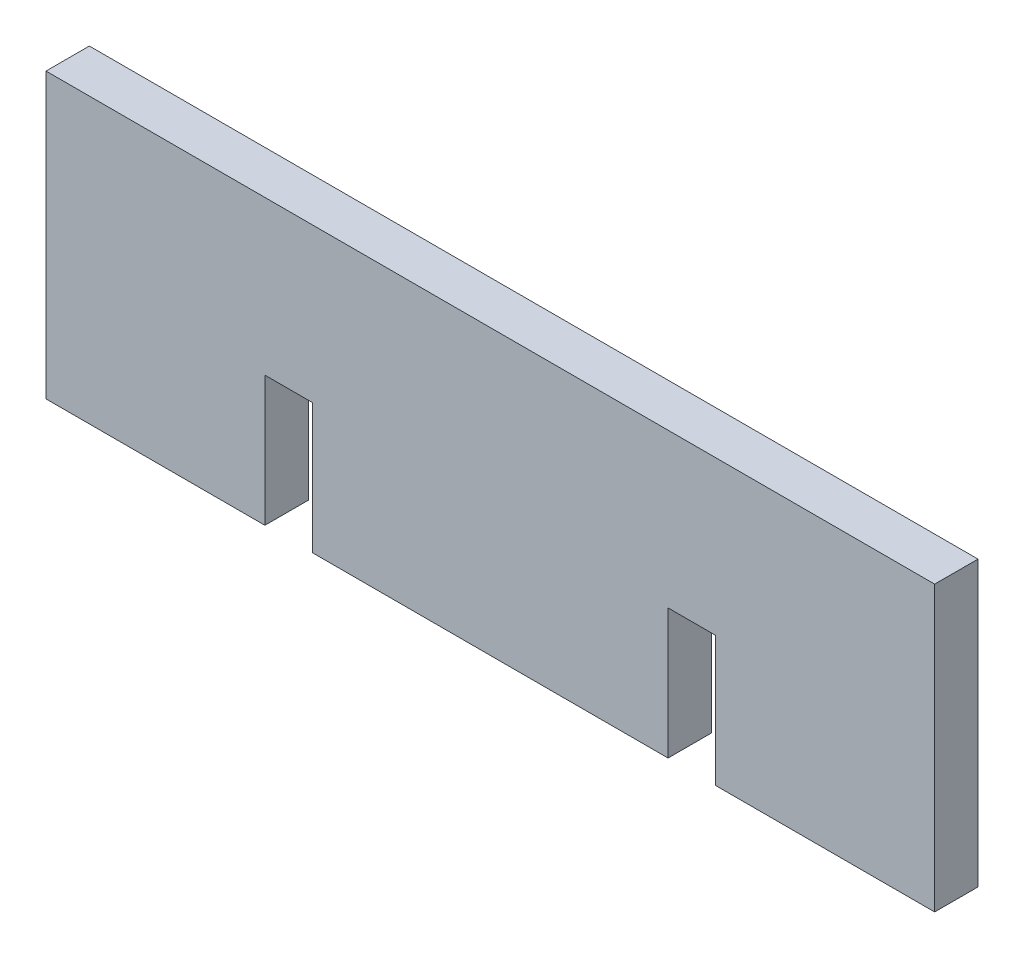
ISO-10303-21;
HEADER;
FILE_DESCRIPTION(('STEP AP214'),'2;1');
FILE_NAME('part.step','',(''),(''),'','','');
FILE_SCHEMA(('AUTOMOTIVE_DESIGN { 1 0 10303 214 1 1 1 1 }'));
ENDSEC;
DATA;
#1=APPLICATION_CONTEXT('core data for automotive mechanical design processes');
#2=APPLICATION_PROTOCOL_DEFINITION('international standard','automotive_design',2000,#1);
#3=PRODUCT_CONTEXT('',#1,'mechanical');
#4=PRODUCT('Part','Part','',(#3));
#5=PRODUCT_RELATED_PRODUCT_CATEGORY('part','',(#4));
#6=PRODUCT_DEFINITION_FORMATION('','',#4);
#7=PRODUCT_DEFINITION_CONTEXT('part definition',#1,'design');
#8=PRODUCT_DEFINITION('design','',#6,#7);
#9=PRODUCT_DEFINITION_SHAPE('','',#8);
#10=(LENGTH_UNIT() NAMED_UNIT(*) SI_UNIT(.MILLI.,.METRE.));
#11=(NAMED_UNIT(*) PLANE_ANGLE_UNIT() SI_UNIT($,.RADIAN.));
#12=(NAMED_UNIT(*) SI_UNIT($,.STERADIAN.) SOLID_ANGLE_UNIT());
#13=UNCERTAINTY_MEASURE_WITH_UNIT(LENGTH_MEASURE(1.E-05),#10,'distance_accuracy_value','');
#14=(GEOMETRIC_REPRESENTATION_CONTEXT(3) GLOBAL_UNCERTAINTY_ASSIGNED_CONTEXT((#13)) GLOBAL_UNIT_ASSIGNED_CONTEXT((#10,
#11,#12)) REPRESENTATION_CONTEXT('',''));
#15=CARTESIAN_POINT('',(0.,0.,0.));
#16=DIRECTION('',(0.,0.,1.));
#17=DIRECTION('',(1.,0.,0.));
#18=AXIS2_PLACEMENT_3D('',#15,#16,#17);
#19=CARTESIAN_POINT('',(52.,0.,10.));
#20=DIRECTION('',(1.,0.,0.));
#21=DIRECTION('',(0.,1.,0.));
#22=AXIS2_PLACEMENT_3D('',#19,#20,#21);
#23=PLANE('',#22);
#24=DIRECTION('',(0.,-1.,0.));
#25=VECTOR('',#24,1.);
#26=CARTESIAN_POINT('',(52.,0.,0.));
#27=LINE('',#26,#25);
#28=CARTESIAN_POINT('',(52.,-2.75000000000001,0.));
#29=VERTEX_POINT('',#28);
#30=CARTESIAN_POINT('',(52.,-32.75,0.));
#31=VERTEX_POINT('',#30);
#32=EDGE_CURVE('E166',#29,#31,#27,.T.);
#33=ORIENTED_EDGE('',*,*,#32,.T.);
#34=DIRECTION('',(0.,0.,-1.));
#35=VECTOR('',#34,1.);
#36=CARTESIAN_POINT('',(52.,-32.75,10.));
#37=LINE('',#36,#35);
#38=CARTESIAN_POINT('',(52.,-32.75,10.));
#39=VERTEX_POINT('',#38);
#40=EDGE_CURVE('E11',#39,#31,#37,.T.);
#41=ORIENTED_EDGE('',*,*,#40,.F.);
#42=DIRECTION('',(0.,-1.,0.));
#43=VECTOR('',#42,1.);
#44=CARTESIAN_POINT('',(52.,0.,10.));
#45=LINE('',#44,#43);
#46=CARTESIAN_POINT('',(52.,-2.75000000000001,10.));
#47=VERTEX_POINT('',#46);
#48=EDGE_CURVE('E207',#47,#39,#45,.T.);
#49=ORIENTED_EDGE('',*,*,#48,.F.);
#50=DIRECTION('',(0.,0.,-1.));
#51=VECTOR('',#50,1.);
#52=CARTESIAN_POINT('',(52.,-2.75000000000001,10.));
#53=LINE('',#52,#51);
#54=EDGE_CURVE('E162',#47,#29,#53,.T.);
#55=ORIENTED_EDGE('',*,*,#54,.T.);
#56=EDGE_LOOP('',(#33,#41,#49,#55));
#57=FACE_BOUND('',#56,.T.);
#58=ADVANCED_FACE('F41',(#57),#23,.F.);
#59=CARTESIAN_POINT('',(0.,-32.75,10.));
#60=DIRECTION('',(0.,1.,0.));
#61=DIRECTION('',(0.,0.,1.));
#62=AXIS2_PLACEMENT_3D('',#59,#60,#61);
#63=PLANE('',#62);
#64=DIRECTION('',(1.,0.,0.));
#65=VECTOR('',#64,1.);
#66=CARTESIAN_POINT('',(0.,-32.75,0.));
#67=LINE('',#66,#65);
#68=CARTESIAN_POINT('',(102.5,-32.75,0.));
#69=VERTEX_POINT('',#68);
#70=EDGE_CURVE('E170',#31,#69,#67,.T.);
#71=ORIENTED_EDGE('',*,*,#70,.T.);
#72=DIRECTION('',(0.,0.,-1.));
#73=VECTOR('',#72,1.);
#74=CARTESIAN_POINT('',(102.5,-32.75,10.));
#75=LINE('',#74,#73);
#76=CARTESIAN_POINT('',(102.5,-32.75,10.));
#77=VERTEX_POINT('',#76);
#78=EDGE_CURVE('E50',#77,#69,#75,.T.);
#79=ORIENTED_EDGE('',*,*,#78,.F.);
#80=DIRECTION('',(1.,0.,0.));
#81=VECTOR('',#80,1.);
#82=CARTESIAN_POINT('',(0.,-32.75,10.));
#83=LINE('',#82,#81);
#84=EDGE_CURVE('E113',#39,#77,#83,.T.);
#85=ORIENTED_EDGE('',*,*,#84,.F.);
#86=ORIENTED_EDGE('',*,*,#40,.T.);
#87=EDGE_LOOP('',(#71,#79,#85,#86));
#88=FACE_BOUND('',#87,.T.);
#89=ADVANCED_FACE('F239',(#88),#63,.F.);
#90=CARTESIAN_POINT('',(102.5,0.,10.));
#91=DIRECTION('',(1.,0.,0.));
#92=DIRECTION('',(0.,0.,-1.));
#93=AXIS2_PLACEMENT_3D('',#90,#91,#92);
#94=PLANE('',#93);
#95=DIRECTION('',(0.,-1.,0.));
#96=VECTOR('',#95,1.);
#97=CARTESIAN_POINT('',(102.5,0.,0.));
#98=LINE('',#97,#96);
#99=CARTESIAN_POINT('',(102.5,32.75,0.));
#100=VERTEX_POINT('',#99);
#101=EDGE_CURVE('E174',#100,#69,#98,.T.);
#102=ORIENTED_EDGE('',*,*,#101,.F.);
#103=DIRECTION('',(0.,0.,-1.));
#104=VECTOR('',#103,1.);
#105=CARTESIAN_POINT('',(102.5,32.75,10.));
#106=LINE('',#105,#104);
#107=CARTESIAN_POINT('',(102.5,32.75,10.));
#108=VERTEX_POINT('',#107);
#109=EDGE_CURVE('E230',#108,#100,#106,.T.);
#110=ORIENTED_EDGE('',*,*,#109,.F.);
#111=DIRECTION('',(0.,-1.,0.));
#112=VECTOR('',#111,1.);
#113=CARTESIAN_POINT('',(102.5,0.,10.));
#114=LINE('',#113,#112);
#115=EDGE_CURVE('E238',#108,#77,#114,.T.);
#116=ORIENTED_EDGE('',*,*,#115,.T.);
#117=ORIENTED_EDGE('',*,*,#78,.T.);
#118=EDGE_LOOP('',(#102,#110,#116,#117));
#119=FACE_BOUND('',#118,.T.);
#120=ADVANCED_FACE('F236',(#119),#94,.T.);
#121=CARTESIAN_POINT('',(0.,32.75,10.));
#122=DIRECTION('',(0.,1.,0.));
#123=DIRECTION('',(0.,0.,1.));
#124=AXIS2_PLACEMENT_3D('',#121,#122,#123);
#125=PLANE('',#124);
#126=DIRECTION('',(1.,0.,0.));
#127=VECTOR('',#126,1.);
#128=CARTESIAN_POINT('',(0.,32.75,0.));
#129=LINE('',#128,#127);
#130=CARTESIAN_POINT('',(-102.5,32.75,0.));
#131=VERTEX_POINT('',#130);
#132=EDGE_CURVE('E178',#131,#100,#129,.T.);
#133=ORIENTED_EDGE('',*,*,#132,.F.);
#134=DIRECTION('',(0.,0.,-1.));
#135=VECTOR('',#134,1.);
#136=CARTESIAN_POINT('',(-102.5,32.75,10.));
#137=LINE('',#136,#135);
#138=CARTESIAN_POINT('',(-102.5,32.75,10.));
#139=VERTEX_POINT('',#138);
#140=EDGE_CURVE('E227',#139,#131,#137,.T.);
#141=ORIENTED_EDGE('',*,*,#140,.F.);
#142=DIRECTION('',(1.,0.,0.));
#143=VECTOR('',#142,1.);
#144=CARTESIAN_POINT('',(0.,32.75,10.));
#145=LINE('',#144,#143);
#146=EDGE_CURVE('E252',#139,#108,#145,.T.);
#147=ORIENTED_EDGE('',*,*,#146,.T.);
#148=ORIENTED_EDGE('',*,*,#109,.T.);
#149=EDGE_LOOP('',(#133,#141,#147,#148));
#150=FACE_BOUND('',#149,.T.);
#151=ADVANCED_FACE('F248',(#150),#125,.T.);
#152=CARTESIAN_POINT('',(-102.5,0.,10.));
#153=DIRECTION('',(1.,0.,0.));
#154=DIRECTION('',(0.,1.,0.));
#155=AXIS2_PLACEMENT_3D('',#152,#153,#154);
#156=PLANE('',#155);
#157=DIRECTION('',(0.,-1.,0.));
#158=VECTOR('',#157,1.);
#159=CARTESIAN_POINT('',(-102.5,0.,0.));
#160=LINE('',#159,#158);
#161=CARTESIAN_POINT('',(-102.5,-32.75,0.));
#162=VERTEX_POINT('',#161);
#163=EDGE_CURVE('E182',#131,#162,#160,.T.);
#164=ORIENTED_EDGE('',*,*,#163,.T.);
#165=DIRECTION('',(0.,0.,-1.));
#166=VECTOR('',#165,1.);
#167=CARTESIAN_POINT('',(-102.5,-32.75,10.));
#168=LINE('',#167,#166);
#169=CARTESIAN_POINT('',(-102.5,-32.75,10.));
#170=VERTEX_POINT('',#169);
#171=EDGE_CURVE('E223',#170,#162,#168,.T.);
#172=ORIENTED_EDGE('',*,*,#171,.F.);
#173=DIRECTION('',(0.,-1.,0.));
#174=VECTOR('',#173,1.);
#175=CARTESIAN_POINT('',(-102.5,0.,10.));
#176=LINE('',#175,#174);
#177=EDGE_CURVE('E257',#139,#170,#176,.T.);
#178=ORIENTED_EDGE('',*,*,#177,.F.);
#179=ORIENTED_EDGE('',*,*,#140,.T.);
#180=EDGE_LOOP('',(#164,#172,#178,#179));
#181=FACE_BOUND('',#180,.T.);
#182=ADVANCED_FACE('F302',(#181),#156,.F.);
#183=CARTESIAN_POINT('',(0.,-32.75,10.));
#184=DIRECTION('',(0.,1.,0.));
#185=DIRECTION('',(0.,0.,1.));
#186=AXIS2_PLACEMENT_3D('',#183,#184,#185);
#187=PLANE('',#186);
#188=DIRECTION('',(1.,0.,0.));
#189=VECTOR('',#188,1.);
#190=CARTESIAN_POINT('',(0.,-32.75,0.));
#191=LINE('',#190,#189);
#192=CARTESIAN_POINT('',(-52.,-32.75,0.));
#193=VERTEX_POINT('',#192);
#194=EDGE_CURVE('E185',#162,#193,#191,.T.);
#195=ORIENTED_EDGE('',*,*,#194,.T.);
#196=DIRECTION('',(0.,0.,-1.));
#197=VECTOR('',#196,1.);
#198=CARTESIAN_POINT('',(-52.,-32.75,10.));
#199=LINE('',#198,#197);
#200=CARTESIAN_POINT('',(-52.,-32.75,10.));
#201=VERTEX_POINT('',#200);
#202=EDGE_CURVE('E220',#201,#193,#199,.T.);
#203=ORIENTED_EDGE('',*,*,#202,.F.);
#204=DIRECTION('',(1.,0.,0.));
#205=VECTOR('',#204,1.);
#206=CARTESIAN_POINT('',(0.,-32.75,10.));
#207=LINE('',#206,#205);
#208=EDGE_CURVE('E264',#170,#201,#207,.T.);
#209=ORIENTED_EDGE('',*,*,#208,.F.);
#210=ORIENTED_EDGE('',*,*,#171,.T.);
#211=EDGE_LOOP('',(#195,#203,#209,#210));
#212=FACE_BOUND('',#211,.T.);
#213=ADVANCED_FACE('F305',(#212),#187,.F.);
#214=CARTESIAN_POINT('',(-52.,0.,10.));
#215=DIRECTION('',(1.,0.,0.));
#216=DIRECTION('',(0.,1.,0.));
#217=AXIS2_PLACEMENT_3D('',#214,#215,#216);
#218=PLANE('',#217);
#219=DIRECTION('',(0.,-1.,0.));
#220=VECTOR('',#219,1.);
#221=CARTESIAN_POINT('',(-52.,0.,0.));
#222=LINE('',#221,#220);
#223=CARTESIAN_POINT('',(-52.,-2.75000000000001,0.));
#224=VERTEX_POINT('',#223);
#225=EDGE_CURVE('E189',#224,#193,#222,.T.);
#226=ORIENTED_EDGE('',*,*,#225,.F.);
#227=DIRECTION('',(0.,0.,-1.));
#228=VECTOR('',#227,1.);
#229=CARTESIAN_POINT('',(-52.,-2.75000000000001,10.));
#230=LINE('',#229,#228);
#231=CARTESIAN_POINT('',(-52.,-2.75000000000001,10.));
#232=VERTEX_POINT('',#231);
#233=EDGE_CURVE('E217',#232,#224,#230,.T.);
#234=ORIENTED_EDGE('',*,*,#233,.F.);
#235=DIRECTION('',(0.,-1.,0.));
#236=VECTOR('',#235,1.);
#237=CARTESIAN_POINT('',(-52.,0.,10.));
#238=LINE('',#237,#236);
#239=EDGE_CURVE('E267',#232,#201,#238,.T.);
#240=ORIENTED_EDGE('',*,*,#239,.T.);
#241=ORIENTED_EDGE('',*,*,#202,.T.);
#242=EDGE_LOOP('',(#226,#234,#240,#241));
#243=FACE_BOUND('',#242,.T.);
#244=ADVANCED_FACE('F309',(#243),#218,.T.);
#245=CARTESIAN_POINT('',(0.,-2.75,10.));
#246=DIRECTION('',(0.,-1.,0.));
#247=DIRECTION('',(1.,0.,0.));
#248=AXIS2_PLACEMENT_3D('',#245,#246,#247);
#249=PLANE('',#248);
#250=DIRECTION('',(-1.,0.,0.));
#251=VECTOR('',#250,1.);
#252=CARTESIAN_POINT('',(0.,-2.75,0.));
#253=LINE('',#252,#251);
#254=CARTESIAN_POINT('',(-41.,-2.75000000000001,0.));
#255=VERTEX_POINT('',#254);
#256=EDGE_CURVE('E193',#255,#224,#253,.T.);
#257=ORIENTED_EDGE('',*,*,#256,.F.);
#258=DIRECTION('',(0.,0.,-1.));
#259=VECTOR('',#258,1.);
#260=CARTESIAN_POINT('',(-41.,-2.75000000000001,10.));
#261=LINE('',#260,#259);
#262=CARTESIAN_POINT('',(-41.,-2.75000000000001,10.));
#263=VERTEX_POINT('',#262);
#264=EDGE_CURVE('E214',#263,#255,#261,.T.);
#265=ORIENTED_EDGE('',*,*,#264,.F.);
#266=DIRECTION('',(-1.,0.,0.));
#267=VECTOR('',#266,1.);
#268=CARTESIAN_POINT('',(0.,-2.75,10.));
#269=LINE('',#268,#267);
#270=EDGE_CURVE('E271',#263,#232,#269,.T.);
#271=ORIENTED_EDGE('',*,*,#270,.T.);
#272=ORIENTED_EDGE('',*,*,#233,.T.);
#273=EDGE_LOOP('',(#257,#265,#271,#272));
#274=FACE_BOUND('',#273,.T.);
#275=ADVANCED_FACE('F313',(#274),#249,.T.);
#276=CARTESIAN_POINT('',(-41.,0.,10.));
#277=DIRECTION('',(-1.,0.,0.));
#278=DIRECTION('',(0.,0.,1.));
#279=AXIS2_PLACEMENT_3D('',#276,#277,#278);
#280=PLANE('',#279);
#281=DIRECTION('',(0.,1.,0.));
#282=VECTOR('',#281,1.);
#283=CARTESIAN_POINT('',(-41.,0.,0.));
#284=LINE('',#283,#282);
#285=CARTESIAN_POINT('',(-41.,-32.75,0.));
#286=VERTEX_POINT('',#285);
#287=EDGE_CURVE('E197',#286,#255,#284,.T.);
#288=ORIENTED_EDGE('',*,*,#287,.F.);
#289=DIRECTION('',(0.,0.,-1.));
#290=VECTOR('',#289,1.);
#291=CARTESIAN_POINT('',(-41.,-32.75,10.));
#292=LINE('',#291,#290);
#293=CARTESIAN_POINT('',(-41.,-32.75,10.));
#294=VERTEX_POINT('',#293);
#295=EDGE_CURVE('E155',#294,#286,#292,.T.);
#296=ORIENTED_EDGE('',*,*,#295,.F.);
#297=DIRECTION('',(0.,1.,0.));
#298=VECTOR('',#297,1.);
#299=CARTESIAN_POINT('',(-41.,0.,10.));
#300=LINE('',#299,#298);
#301=EDGE_CURVE('E146',#294,#263,#300,.T.);
#302=ORIENTED_EDGE('',*,*,#301,.T.);
#303=ORIENTED_EDGE('',*,*,#264,.T.);
#304=EDGE_LOOP('',(#288,#296,#302,#303));
#305=FACE_BOUND('',#304,.T.);
#306=ADVANCED_FACE('F277',(#305),#280,.T.);
#307=CARTESIAN_POINT('',(0.,-32.75,10.));
#308=DIRECTION('',(0.,1.,0.));
#309=DIRECTION('',(0.,0.,1.));
#310=AXIS2_PLACEMENT_3D('',#307,#308,#309);
#311=PLANE('',#310);
#312=DIRECTION('',(1.,0.,0.));
#313=VECTOR('',#312,1.);
#314=CARTESIAN_POINT('',(0.,-32.75,0.));
#315=LINE('',#314,#313);
#316=CARTESIAN_POINT('',(41.,-32.75,0.));
#317=VERTEX_POINT('',#316);
#318=EDGE_CURVE('E153',#286,#317,#315,.T.);
#319=ORIENTED_EDGE('',*,*,#318,.T.);
#320=DIRECTION('',(0.,0.,-1.));
#321=VECTOR('',#320,1.);
#322=CARTESIAN_POINT('',(41.,-32.75,10.));
#323=LINE('',#322,#321);
#324=CARTESIAN_POINT('',(41.,-32.75,10.));
#325=VERTEX_POINT('',#324);
#326=EDGE_CURVE('E150',#325,#317,#323,.T.);
#327=ORIENTED_EDGE('',*,*,#326,.F.);
#328=DIRECTION('',(1.,0.,0.));
#329=VECTOR('',#328,1.);
#330=CARTESIAN_POINT('',(0.,-32.75,10.));
#331=LINE('',#330,#329);
#332=EDGE_CURVE('E139',#294,#325,#331,.T.);
#333=ORIENTED_EDGE('',*,*,#332,.F.);
#334=ORIENTED_EDGE('',*,*,#295,.T.);
#335=EDGE_LOOP('',(#319,#327,#333,#334));
#336=FACE_BOUND('',#335,.T.);
#337=ADVANCED_FACE('F151',(#336),#311,.F.);
#338=CARTESIAN_POINT('',(41.,0.,10.));
#339=DIRECTION('',(-1.,0.,0.));
#340=DIRECTION('',(0.,0.,1.));
#341=AXIS2_PLACEMENT_3D('',#338,#339,#340);
#342=PLANE('',#341);
#343=DIRECTION('',(0.,1.,0.));
#344=VECTOR('',#343,1.);
#345=CARTESIAN_POINT('',(41.,0.,0.));
#346=LINE('',#345,#344);
#347=CARTESIAN_POINT('',(41.,-2.75000000000001,0.));
#348=VERTEX_POINT('',#347);
#349=EDGE_CURVE('E99',#317,#348,#346,.T.);
#350=ORIENTED_EDGE('',*,*,#349,.T.);
#351=DIRECTION('',(0.,0.,-1.));
#352=VECTOR('',#351,1.);
#353=CARTESIAN_POINT('',(41.,-2.75000000000001,10.));
#354=LINE('',#353,#352);
#355=CARTESIAN_POINT('',(41.,-2.75000000000001,10.));
#356=VERTEX_POINT('',#355);
#357=EDGE_CURVE('E156',#356,#348,#354,.T.);
#358=ORIENTED_EDGE('',*,*,#357,.F.);
#359=DIRECTION('',(0.,1.,0.));
#360=VECTOR('',#359,1.);
#361=CARTESIAN_POINT('',(41.,0.,10.));
#362=LINE('',#361,#360);
#363=EDGE_CURVE('E143',#325,#356,#362,.T.);
#364=ORIENTED_EDGE('',*,*,#363,.F.);
#365=ORIENTED_EDGE('',*,*,#326,.T.);
#366=EDGE_LOOP('',(#350,#358,#364,#365));
#367=FACE_BOUND('',#366,.T.);
#368=ADVANCED_FACE('F158',(#367),#342,.F.);
#369=CARTESIAN_POINT('',(0.,-2.75000000000001,10.));
#370=DIRECTION('',(0.,1.,0.));
#371=DIRECTION('',(0.,0.,1.));
#372=AXIS2_PLACEMENT_3D('',#369,#370,#371);
#373=PLANE('',#372);
#374=DIRECTION('',(1.,0.,0.));
#375=VECTOR('',#374,1.);
#376=CARTESIAN_POINT('',(0.,-2.75000000000001,0.));
#377=LINE('',#376,#375);
#378=EDGE_CURVE('E105',#348,#29,#377,.T.);
#379=ORIENTED_EDGE('',*,*,#378,.T.);
#380=ORIENTED_EDGE('',*,*,#54,.F.);
#381=DIRECTION('',(1.,0.,0.));
#382=VECTOR('',#381,1.);
#383=CARTESIAN_POINT('',(0.,-2.75000000000001,10.));
#384=LINE('',#383,#382);
#385=EDGE_CURVE('E58',#356,#47,#384,.T.);
#386=ORIENTED_EDGE('',*,*,#385,.F.);
#387=ORIENTED_EDGE('',*,*,#357,.T.);
#388=EDGE_LOOP('',(#379,#380,#386,#387));
#389=FACE_BOUND('',#388,.T.);
#390=ADVANCED_FACE('F281',(#389),#373,.F.);
#391=CARTESIAN_POINT('',(0.,0.,10.));
#392=DIRECTION('',(0.,0.,1.));
#393=DIRECTION('',(1.,0.,0.));
#394=AXIS2_PLACEMENT_3D('',#391,#392,#393);
#395=PLANE('',#394);
#396=ORIENTED_EDGE('',*,*,#48,.T.);
#397=ORIENTED_EDGE('',*,*,#84,.T.);
#398=ORIENTED_EDGE('',*,*,#115,.F.);
#399=ORIENTED_EDGE('',*,*,#146,.F.);
#400=ORIENTED_EDGE('',*,*,#177,.T.);
#401=ORIENTED_EDGE('',*,*,#208,.T.);
#402=ORIENTED_EDGE('',*,*,#239,.F.);
#403=ORIENTED_EDGE('',*,*,#270,.F.);
#404=ORIENTED_EDGE('',*,*,#301,.F.);
#405=ORIENTED_EDGE('',*,*,#332,.T.);
#406=ORIENTED_EDGE('',*,*,#363,.T.);
#407=ORIENTED_EDGE('',*,*,#385,.T.);
#408=EDGE_LOOP('',(#396,#397,#398,#399,#400,#401,#402,#403,#404,#405,#406,#407));
#409=FACE_BOUND('',#408,.T.);
#410=ADVANCED_FACE('F141',(#409),#395,.T.);
#411=CARTESIAN_POINT('',(0.,0.,0.));
#412=DIRECTION('',(0.,0.,1.));
#413=DIRECTION('',(1.,0.,0.));
#414=AXIS2_PLACEMENT_3D('',#411,#412,#413);
#415=PLANE('',#414);
#416=ORIENTED_EDGE('',*,*,#32,.F.);
#417=ORIENTED_EDGE('',*,*,#378,.F.);
#418=ORIENTED_EDGE('',*,*,#349,.F.);
#419=ORIENTED_EDGE('',*,*,#318,.F.);
#420=ORIENTED_EDGE('',*,*,#287,.T.);
#421=ORIENTED_EDGE('',*,*,#256,.T.);
#422=ORIENTED_EDGE('',*,*,#225,.T.);
#423=ORIENTED_EDGE('',*,*,#194,.F.);
#424=ORIENTED_EDGE('',*,*,#163,.F.);
#425=ORIENTED_EDGE('',*,*,#132,.T.);
#426=ORIENTED_EDGE('',*,*,#101,.T.);
#427=ORIENTED_EDGE('',*,*,#70,.F.);
#428=EDGE_LOOP('',(#416,#417,#418,#419,#420,#421,#422,#423,#424,#425,#426,#427));
#429=FACE_BOUND('',#428,.T.);
#430=ADVANCED_FACE('F243',(#429),#415,.F.);
#431=CLOSED_SHELL('',(#58,#89,#120,#151,#182,#213,#244,#275,#306,#337,#368,#390,#410,#430));
#432=MANIFOLD_SOLID_BREP('B2',#431);
#433=ADVANCED_BREP_SHAPE_REPRESENTATION('',(#18,#432),#14);
#434=SHAPE_DEFINITION_REPRESENTATION(#9,#433);
ENDSEC;
END-ISO-10303-21;
